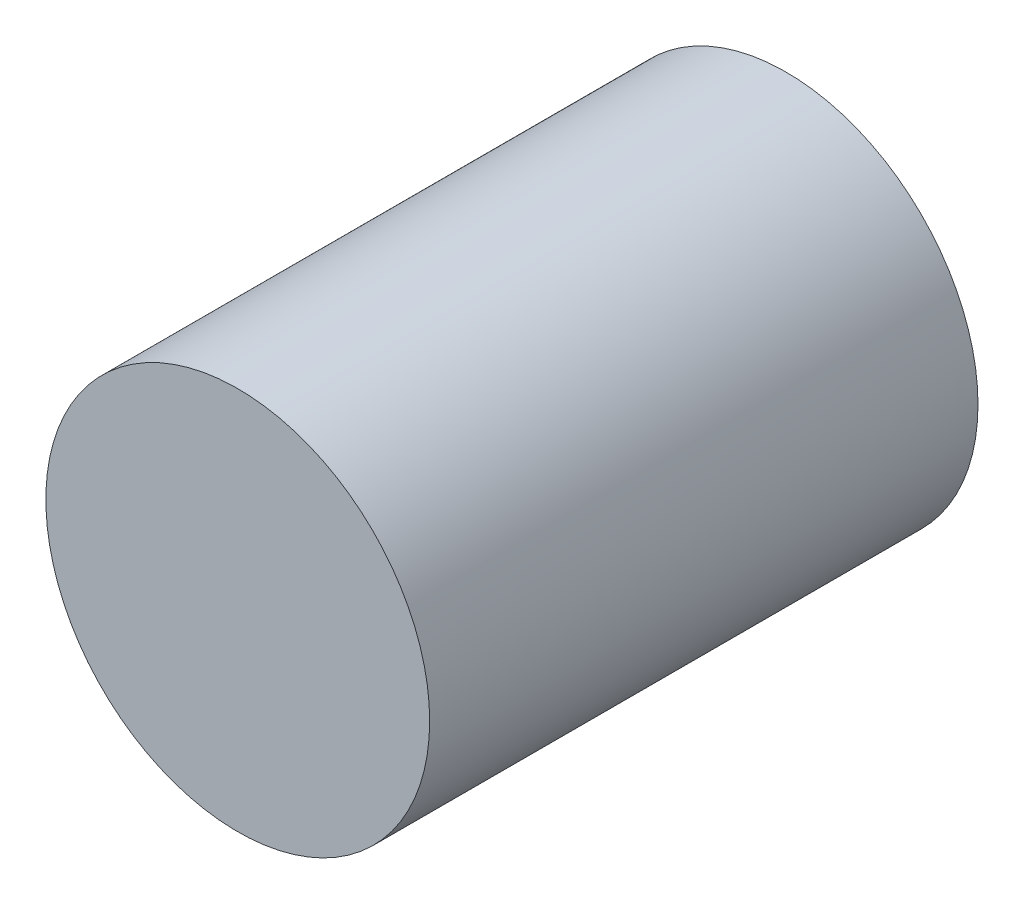
ISO-10303-21;
HEADER;
FILE_DESCRIPTION(('STEP AP214'),'2;1');
FILE_NAME('part.step','',(''),(''),'','','');
FILE_SCHEMA(('AUTOMOTIVE_DESIGN { 1 0 10303 214 1 1 1 1 }'));
ENDSEC;
DATA;
#1=APPLICATION_CONTEXT('core data for automotive mechanical design processes');
#2=APPLICATION_PROTOCOL_DEFINITION('international standard','automotive_design',2000,#1);
#3=PRODUCT_CONTEXT('',#1,'mechanical');
#4=PRODUCT('Part','Part','',(#3));
#5=PRODUCT_RELATED_PRODUCT_CATEGORY('part','',(#4));
#6=PRODUCT_DEFINITION_FORMATION('','',#4);
#7=PRODUCT_DEFINITION_CONTEXT('part definition',#1,'design');
#8=PRODUCT_DEFINITION('design','',#6,#7);
#9=PRODUCT_DEFINITION_SHAPE('','',#8);
#10=(LENGTH_UNIT() NAMED_UNIT(*) SI_UNIT(.MILLI.,.METRE.));
#11=(NAMED_UNIT(*) PLANE_ANGLE_UNIT() SI_UNIT($,.RADIAN.));
#12=(NAMED_UNIT(*) SI_UNIT($,.STERADIAN.) SOLID_ANGLE_UNIT());
#13=UNCERTAINTY_MEASURE_WITH_UNIT(LENGTH_MEASURE(1.E-05),#10,'distance_accuracy_value','');
#14=(GEOMETRIC_REPRESENTATION_CONTEXT(3) GLOBAL_UNCERTAINTY_ASSIGNED_CONTEXT((#13)) GLOBAL_UNIT_ASSIGNED_CONTEXT((#10,
#11,#12)) REPRESENTATION_CONTEXT('',''));
#15=CARTESIAN_POINT('',(0.,0.,0.));
#16=DIRECTION('',(0.,0.,1.));
#17=DIRECTION('',(1.,0.,0.));
#18=AXIS2_PLACEMENT_3D('',#15,#16,#17);
#19=CARTESIAN_POINT('',(0.,0.,12.7));
#20=DIRECTION('',(0.,0.,-1.));
#21=DIRECTION('',(-1.,0.,0.));
#22=AXIS2_PLACEMENT_3D('',#19,#20,#21);
#23=CYLINDRICAL_SURFACE('',#22,4.445);
#24=CARTESIAN_POINT('',(0.,0.,12.7));
#25=DIRECTION('',(0.,0.,1.));
#26=DIRECTION('',(1.,0.,0.));
#27=AXIS2_PLACEMENT_3D('',#24,#25,#26);
#28=CIRCLE('',#27,4.445);
#29=CARTESIAN_POINT('',(4.445,0.,12.7));
#30=VERTEX_POINT('',#29);
#31=EDGE_CURVE('E10',#30,#30,#28,.T.);
#32=ORIENTED_EDGE('',*,*,#31,.F.);
#33=EDGE_LOOP('',(#32));
#34=FACE_BOUND('',#33,.T.);
#35=CARTESIAN_POINT('',(0.,0.,0.));
#36=DIRECTION('',(0.,0.,1.));
#37=DIRECTION('',(1.,0.,0.));
#38=AXIS2_PLACEMENT_3D('',#35,#36,#37);
#39=CIRCLE('',#38,4.445);
#40=CARTESIAN_POINT('',(4.445,0.,0.));
#41=VERTEX_POINT('',#40);
#42=EDGE_CURVE('E44',#41,#41,#39,.T.);
#43=ORIENTED_EDGE('',*,*,#42,.T.);
#44=EDGE_LOOP('',(#43));
#45=FACE_BOUND('',#44,.T.);
#46=ADVANCED_FACE('F41',(#34,#45),#23,.T.);
#47=CARTESIAN_POINT('',(0.,0.,12.7));
#48=DIRECTION('',(0.,0.,1.));
#49=DIRECTION('',(1.,0.,0.));
#50=AXIS2_PLACEMENT_3D('',#47,#48,#49);
#51=PLANE('',#50);
#52=ORIENTED_EDGE('',*,*,#31,.T.);
#53=EDGE_LOOP('',(#52));
#54=FACE_BOUND('',#53,.T.);
#55=ADVANCED_FACE('F58',(#54),#51,.T.);
#56=CARTESIAN_POINT('',(0.,0.,0.));
#57=DIRECTION('',(0.,0.,1.));
#58=DIRECTION('',(1.,0.,0.));
#59=AXIS2_PLACEMENT_3D('',#56,#57,#58);
#60=PLANE('',#59);
#61=ORIENTED_EDGE('',*,*,#42,.F.);
#62=EDGE_LOOP('',(#61));
#63=FACE_BOUND('',#62,.T.);
#64=ADVANCED_FACE('F56',(#63),#60,.F.);
#65=CLOSED_SHELL('',(#46,#55,#64));
#66=MANIFOLD_SOLID_BREP('B2',#65);
#67=ADVANCED_BREP_SHAPE_REPRESENTATION('',(#18,#66),#14);
#68=SHAPE_DEFINITION_REPRESENTATION(#9,#67);
ENDSEC;
END-ISO-10303-21;
